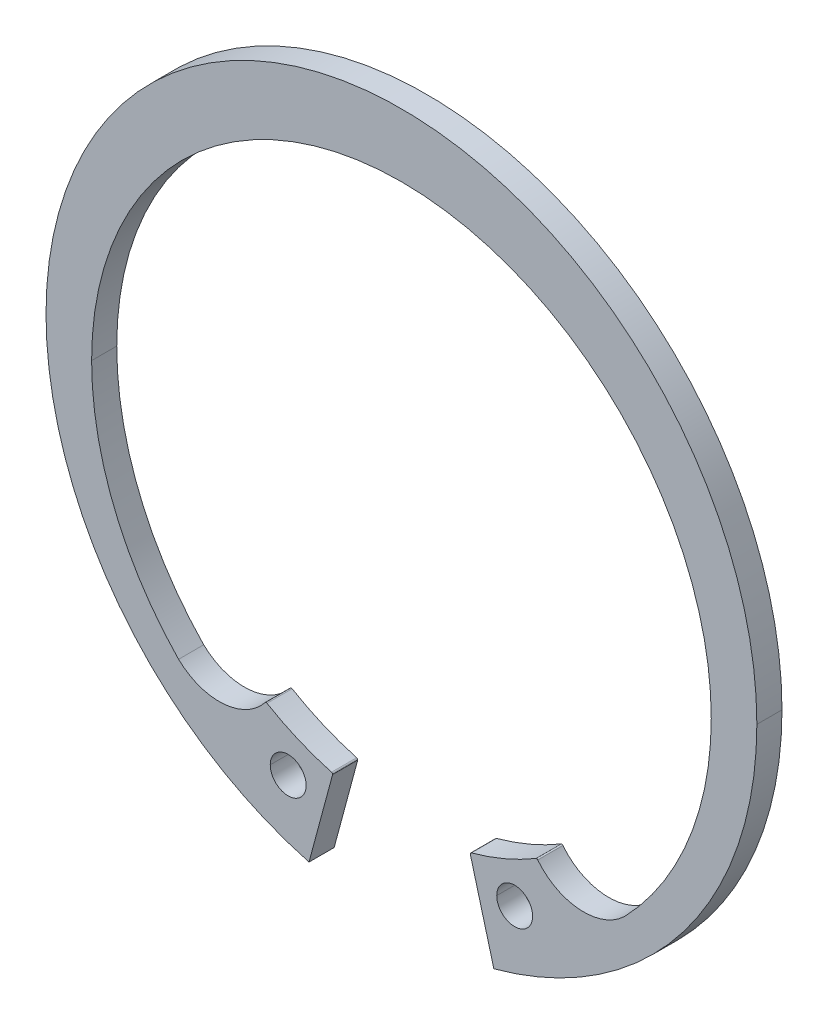
ISO-10303-21;
HEADER;
FILE_DESCRIPTION(('STEP AP214'),'2;1');
FILE_NAME('part.step','',(''),(''),'','','');
FILE_SCHEMA(('AUTOMOTIVE_DESIGN { 1 0 10303 214 1 1 1 1 }'));
ENDSEC;
DATA;
#1=APPLICATION_CONTEXT('core data for automotive mechanical design processes');
#2=APPLICATION_PROTOCOL_DEFINITION('international standard','automotive_design',2000,#1);
#3=PRODUCT_CONTEXT('',#1,'mechanical');
#4=PRODUCT('Part','Part','',(#3));
#5=PRODUCT_RELATED_PRODUCT_CATEGORY('part','',(#4));
#6=PRODUCT_DEFINITION_FORMATION('','',#4);
#7=PRODUCT_DEFINITION_CONTEXT('part definition',#1,'design');
#8=PRODUCT_DEFINITION('design','',#6,#7);
#9=PRODUCT_DEFINITION_SHAPE('','',#8);
#10=(LENGTH_UNIT() NAMED_UNIT(*) SI_UNIT(.MILLI.,.METRE.));
#11=(NAMED_UNIT(*) PLANE_ANGLE_UNIT() SI_UNIT($,.RADIAN.));
#12=(NAMED_UNIT(*) SI_UNIT($,.STERADIAN.) SOLID_ANGLE_UNIT());
#13=UNCERTAINTY_MEASURE_WITH_UNIT(LENGTH_MEASURE(1.E-05),#10,'distance_accuracy_value','');
#14=(GEOMETRIC_REPRESENTATION_CONTEXT(3) GLOBAL_UNCERTAINTY_ASSIGNED_CONTEXT((#13)) GLOBAL_UNIT_ASSIGNED_CONTEXT((#10,
#11,#12)) REPRESENTATION_CONTEXT('',''));
#15=CARTESIAN_POINT('',(0.,0.,0.));
#16=DIRECTION('',(0.,0.,1.));
#17=DIRECTION('',(1.,0.,0.));
#18=AXIS2_PLACEMENT_3D('',#15,#16,#17);
#19=CARTESIAN_POINT('',(-4.89431786511228,-17.788989646274,-1.75));
#20=DIRECTION('',(0.,0.,1.));
#21=DIRECTION('',(1.,0.,0.));
#22=AXIS2_PLACEMENT_3D('',#19,#20,#21);
#23=CYLINDRICAL_SURFACE('',#22,0.0999999999999985);
#24=DIRECTION('',(0.,0.,1.));
#25=VECTOR('',#24,1.);
#26=CARTESIAN_POINT('',(-4.79431786511229,-17.788989646274,-1.75));
#27=LINE('',#26,#25);
#28=CARTESIAN_POINT('',(-4.79431786511229,-17.788989646274,-1.75));
#29=VERTEX_POINT('',#28);
#30=CARTESIAN_POINT('',(-4.79431786511229,-17.788989646274,0.));
#31=VERTEX_POINT('',#30);
#32=EDGE_CURVE('E280',#29,#31,#27,.T.);
#33=ORIENTED_EDGE('',*,*,#32,.F.);
#34=CARTESIAN_POINT('',(-4.89431786511228,-17.788989646274,-1.75));
#35=DIRECTION('',(0.,0.,1.));
#36=DIRECTION('',(-1.,0.,0.));
#37=AXIS2_PLACEMENT_3D('',#34,#35,#36);
#38=CIRCLE('',#37,0.0999999999999985);
#39=CARTESIAN_POINT('',(-4.8677903970087,-17.6925723582183,-1.75));
#40=VERTEX_POINT('',#39);
#41=EDGE_CURVE('E285',#29,#40,#38,.T.);
#42=ORIENTED_EDGE('',*,*,#41,.T.);
#43=DIRECTION('',(0.,0.,1.));
#44=VECTOR('',#43,1.);
#45=CARTESIAN_POINT('',(-4.8677903970087,-17.6925723582183,-1.75));
#46=LINE('',#45,#44);
#47=CARTESIAN_POINT('',(-4.8677903970087,-17.6925723582183,0.));
#48=VERTEX_POINT('',#47);
#49=EDGE_CURVE('E334',#40,#48,#46,.T.);
#50=ORIENTED_EDGE('',*,*,#49,.T.);
#51=CARTESIAN_POINT('',(-4.89431786511228,-17.788989646274,0.));
#52=DIRECTION('',(0.,0.,1.));
#53=DIRECTION('',(-1.,0.,0.));
#54=AXIS2_PLACEMENT_3D('',#51,#52,#53);
#55=CIRCLE('',#54,0.0999999999999985);
#56=EDGE_CURVE('E179',#31,#48,#55,.T.);
#57=ORIENTED_EDGE('',*,*,#56,.F.);
#58=EDGE_LOOP('',(#33,#42,#50,#57));
#59=FACE_BOUND('',#58,.T.);
#60=ADVANCED_FACE('F17',(#59),#23,.T.);
#61=CARTESIAN_POINT('',(-9.41305019519653,-15.868112238786,-1.75));
#62=DIRECTION('',(0.,0.,1.));
#63=DIRECTION('',(1.,0.,0.));
#64=AXIS2_PLACEMENT_3D('',#61,#62,#63);
#65=CYLINDRICAL_SURFACE('',#64,0.0999999999999977);
#66=CARTESIAN_POINT('',(-9.41305019519653,-15.868112238786,0.));
#67=DIRECTION('',(0.,0.,1.));
#68=DIRECTION('',(1.,0.,0.));
#69=AXIS2_PLACEMENT_3D('',#66,#67,#68);
#70=CIRCLE('',#69,0.0999999999999977);
#71=CARTESIAN_POINT('',(-9.36203095294614,-15.7821062103915,0.));
#72=VERTEX_POINT('',#71);
#73=CARTESIAN_POINT('',(-9.49123336413031,-15.8057632845408,0.));
#74=VERTEX_POINT('',#73);
#75=EDGE_CURVE('E374',#72,#74,#70,.T.);
#76=ORIENTED_EDGE('',*,*,#75,.F.);
#77=DIRECTION('',(0.,0.,1.));
#78=VECTOR('',#77,1.);
#79=CARTESIAN_POINT('',(-9.36203095294614,-15.7821062103915,-1.75));
#80=LINE('',#79,#78);
#81=CARTESIAN_POINT('',(-9.36203095294614,-15.7821062103915,-1.75));
#82=VERTEX_POINT('',#81);
#83=EDGE_CURVE('E253',#82,#72,#80,.T.);
#84=ORIENTED_EDGE('',*,*,#83,.F.);
#85=CARTESIAN_POINT('',(-9.41305019519653,-15.868112238786,-1.75));
#86=DIRECTION('',(0.,0.,1.));
#87=DIRECTION('',(1.,0.,0.));
#88=AXIS2_PLACEMENT_3D('',#85,#86,#87);
#89=CIRCLE('',#88,0.0999999999999977);
#90=CARTESIAN_POINT('',(-9.49123336413031,-15.8057632845408,-1.75));
#91=VERTEX_POINT('',#90);
#92=EDGE_CURVE('E260',#82,#91,#89,.T.);
#93=ORIENTED_EDGE('',*,*,#92,.T.);
#94=DIRECTION('',(0.,0.,1.));
#95=VECTOR('',#94,1.);
#96=CARTESIAN_POINT('',(-9.49123336413031,-15.8057632845408,-1.75));
#97=LINE('',#96,#95);
#98=EDGE_CURVE('E11',#91,#74,#97,.T.);
#99=ORIENTED_EDGE('',*,*,#98,.T.);
#100=EDGE_LOOP('',(#76,#84,#93,#99));
#101=FACE_BOUND('',#100,.T.);
#102=ADVANCED_FACE('F19',(#101),#65,.T.);
#103=CARTESIAN_POINT('',(-12.6890046847331,-13.2556274883847,-1.75));
#104=DIRECTION('',(0.,0.,1.));
#105=DIRECTION('',(1.,0.,0.));
#106=AXIS2_PLACEMENT_3D('',#103,#104,#105);
#107=CYLINDRICAL_SURFACE('',#106,4.09010195443912);
#108=CARTESIAN_POINT('',(-12.6890046847331,-13.2556274883847,0.));
#109=DIRECTION('',(0.,0.,-1.));
#110=DIRECTION('',(1.,0.,0.));
#111=AXIS2_PLACEMENT_3D('',#108,#109,#110);
#112=CIRCLE('',#111,4.09010195443912);
#113=CARTESIAN_POINT('',(-15.51730565808,-16.2102251939737,0.));
#114=VERTEX_POINT('',#113);
#115=EDGE_CURVE('E370',#74,#114,#112,.T.);
#116=ORIENTED_EDGE('',*,*,#115,.F.);
#117=ORIENTED_EDGE('',*,*,#98,.F.);
#118=CARTESIAN_POINT('',(-12.6890046847331,-13.2556274883847,-1.75));
#119=DIRECTION('',(0.,0.,-1.));
#120=DIRECTION('',(1.,0.,0.));
#121=AXIS2_PLACEMENT_3D('',#118,#119,#120);
#122=CIRCLE('',#121,4.09010195443912);
#123=CARTESIAN_POINT('',(-15.51730565808,-16.2102251939737,-1.75));
#124=VERTEX_POINT('',#123);
#125=EDGE_CURVE('E256',#91,#124,#122,.T.);
#126=ORIENTED_EDGE('',*,*,#125,.T.);
#127=DIRECTION('',(0.,0.,1.));
#128=VECTOR('',#127,1.);
#129=CARTESIAN_POINT('',(-15.51730565808,-16.2102251939737,-1.75));
#130=LINE('',#129,#128);
#131=EDGE_CURVE('E28',#124,#114,#130,.T.);
#132=ORIENTED_EDGE('',*,*,#131,.T.);
#133=EDGE_LOOP('',(#116,#117,#126,#132));
#134=FACE_BOUND('',#133,.T.);
#135=ADVANCED_FACE('F257',(#134),#107,.F.);
#136=CARTESIAN_POINT('',(-17.1145975992995,-17.8788436151238,-1.75));
#137=DIRECTION('',(-0.722377519802981,0.69149889290099,0.));
#138=DIRECTION('',(0.,0.,1.));
#139=AXIS2_PLACEMENT_3D('',#136,#137,#138);
#140=PLANE('',#139);
#141=DIRECTION('',(-0.691498892900989,-0.722377519802981,0.));
#142=VECTOR('',#141,1.);
#143=CARTESIAN_POINT('',(-17.1145975992995,-17.8788436151238,-1.75));
#144=LINE('',#143,#142);
#145=CARTESIAN_POINT('',(-15.5200012228605,-16.213041128201,-1.75));
#146=VERTEX_POINT('',#145);
#147=EDGE_CURVE('E248',#124,#146,#144,.T.);
#148=ORIENTED_EDGE('',*,*,#147,.T.);
#149=DIRECTION('',(0.,0.,1.));
#150=VECTOR('',#149,1.);
#151=CARTESIAN_POINT('',(-15.5200012228605,-16.213041128201,-1.75));
#152=LINE('',#151,#150);
#153=CARTESIAN_POINT('',(-15.5200012228605,-16.213041128201,0.));
#154=VERTEX_POINT('',#153);
#155=EDGE_CURVE('E302',#146,#154,#152,.T.);
#156=ORIENTED_EDGE('',*,*,#155,.T.);
#157=DIRECTION('',(-0.691498892900989,-0.722377519802981,0.));
#158=VECTOR('',#157,1.);
#159=CARTESIAN_POINT('',(-17.1145975992995,-17.8788436151238,0.));
#160=LINE('',#159,#158);
#161=EDGE_CURVE('E250',#114,#154,#160,.T.);
#162=ORIENTED_EDGE('',*,*,#161,.F.);
#163=ORIENTED_EDGE('',*,*,#131,.F.);
#164=EDGE_LOOP('',(#148,#156,#162,#163));
#165=FACE_BOUND('',#164,.T.);
#166=ADVANCED_FACE('F245',(#165),#140,.T.);
#167=CARTESIAN_POINT('',(0.,0.,-1.75));
#168=DIRECTION('',(0.,0.,1.));
#169=DIRECTION('',(1.,0.,0.));
#170=AXIS2_PLACEMENT_3D('',#167,#168,#169);
#171=CYLINDRICAL_SURFACE('',#170,18.35);
#172=CARTESIAN_POINT('',(0.,0.,0.));
#173=DIRECTION('',(0.,0.,-1.));
#174=DIRECTION('',(1.,0.,0.));
#175=AXIS2_PLACEMENT_3D('',#172,#173,#174);
#176=CIRCLE('',#175,18.35);
#177=EDGE_CURVE('E416',#48,#72,#176,.T.);
#178=ORIENTED_EDGE('',*,*,#177,.F.);
#179=ORIENTED_EDGE('',*,*,#49,.F.);
#180=CARTESIAN_POINT('',(0.,0.,-1.75));
#181=DIRECTION('',(0.,0.,-1.));
#182=DIRECTION('',(1.,0.,0.));
#183=AXIS2_PLACEMENT_3D('',#180,#181,#182);
#184=CIRCLE('',#183,18.35);
#185=EDGE_CURVE('E290',#40,#82,#184,.T.);
#186=ORIENTED_EDGE('',*,*,#185,.T.);
#187=ORIENTED_EDGE('',*,*,#83,.T.);
#188=EDGE_LOOP('',(#178,#179,#186,#187));
#189=FACE_BOUND('',#188,.T.);
#190=ADVANCED_FACE('F698',(#189),#171,.F.);
#191=CARTESIAN_POINT('',(15.51730565808,-16.2102251939737,-1.75));
#192=DIRECTION('',(0.722377519802981,0.69149889290099,0.));
#193=DIRECTION('',(0.,0.,-1.));
#194=AXIS2_PLACEMENT_3D('',#191,#192,#193);
#195=PLANE('',#194);
#196=DIRECTION('',(-0.691498892900989,0.722377519802981,0.));
#197=VECTOR('',#196,1.);
#198=CARTESIAN_POINT('',(15.51730565808,-16.2102251939737,0.));
#199=LINE('',#198,#197);
#200=CARTESIAN_POINT('',(15.5200012228605,-16.213041128201,0.));
#201=VERTEX_POINT('',#200);
#202=CARTESIAN_POINT('',(15.51730565808,-16.2102251939737,0.));
#203=VERTEX_POINT('',#202);
#204=EDGE_CURVE('E308',#201,#203,#199,.T.);
#205=ORIENTED_EDGE('',*,*,#204,.F.);
#206=DIRECTION('',(0.,0.,-1.));
#207=VECTOR('',#206,1.);
#208=CARTESIAN_POINT('',(15.5200012228605,-16.213041128201,-1.75));
#209=LINE('',#208,#207);
#210=CARTESIAN_POINT('',(15.5200012228605,-16.213041128201,-1.75));
#211=VERTEX_POINT('',#210);
#212=EDGE_CURVE('E278',#201,#211,#209,.T.);
#213=ORIENTED_EDGE('',*,*,#212,.T.);
#214=DIRECTION('',(-0.691498892900989,0.722377519802981,0.));
#215=VECTOR('',#214,1.);
#216=CARTESIAN_POINT('',(15.51730565808,-16.2102251939737,-1.75));
#217=LINE('',#216,#215);
#218=CARTESIAN_POINT('',(15.51730565808,-16.2102251939737,-1.75));
#219=VERTEX_POINT('',#218);
#220=EDGE_CURVE('E291',#211,#219,#217,.T.);
#221=ORIENTED_EDGE('',*,*,#220,.T.);
#222=DIRECTION('',(0.,0.,1.));
#223=VECTOR('',#222,1.);
#224=CARTESIAN_POINT('',(15.51730565808,-16.2102251939737,-1.75));
#225=LINE('',#224,#223);
#226=EDGE_CURVE('E337',#219,#203,#225,.T.);
#227=ORIENTED_EDGE('',*,*,#226,.T.);
#228=EDGE_LOOP('',(#205,#213,#221,#227));
#229=FACE_BOUND('',#228,.T.);
#230=ADVANCED_FACE('F795',(#229),#195,.T.);
#231=CARTESIAN_POINT('',(12.6890046847331,-13.2556274883847,-1.75));
#232=DIRECTION('',(0.,0.,1.));
#233=DIRECTION('',(1.,0.,0.));
#234=AXIS2_PLACEMENT_3D('',#231,#232,#233);
#235=CYLINDRICAL_SURFACE('',#234,4.09010195443912);
#236=CARTESIAN_POINT('',(12.6890046847331,-13.2556274883847,0.));
#237=DIRECTION('',(0.,0.,-1.));
#238=DIRECTION('',(1.,0.,0.));
#239=AXIS2_PLACEMENT_3D('',#236,#237,#238);
#240=CIRCLE('',#239,4.09010195443912);
#241=CARTESIAN_POINT('',(9.49123336413031,-15.8057632845408,0.));
#242=VERTEX_POINT('',#241);
#243=EDGE_CURVE('E303',#203,#242,#240,.T.);
#244=ORIENTED_EDGE('',*,*,#243,.F.);
#245=ORIENTED_EDGE('',*,*,#226,.F.);
#246=CARTESIAN_POINT('',(12.6890046847331,-13.2556274883847,-1.75));
#247=DIRECTION('',(0.,0.,-1.));
#248=DIRECTION('',(1.,0.,0.));
#249=AXIS2_PLACEMENT_3D('',#246,#247,#248);
#250=CIRCLE('',#249,4.09010195443912);
#251=CARTESIAN_POINT('',(9.49123336413031,-15.8057632845408,-1.75));
#252=VERTEX_POINT('',#251);
#253=EDGE_CURVE('E296',#219,#252,#250,.T.);
#254=ORIENTED_EDGE('',*,*,#253,.T.);
#255=DIRECTION('',(0.,0.,1.));
#256=VECTOR('',#255,1.);
#257=CARTESIAN_POINT('',(9.49123336413031,-15.8057632845408,-1.75));
#258=LINE('',#257,#256);
#259=EDGE_CURVE('E21',#252,#242,#258,.T.);
#260=ORIENTED_EDGE('',*,*,#259,.T.);
#261=EDGE_LOOP('',(#244,#245,#254,#260));
#262=FACE_BOUND('',#261,.T.);
#263=ADVANCED_FACE('F793',(#262),#235,.F.);
#264=CARTESIAN_POINT('',(9.41305019519653,-15.868112238786,-1.75));
#265=DIRECTION('',(0.,0.,1.));
#266=DIRECTION('',(1.,0.,0.));
#267=AXIS2_PLACEMENT_3D('',#264,#265,#266);
#268=CYLINDRICAL_SURFACE('',#267,0.0999999999999977);
#269=CARTESIAN_POINT('',(9.41305019519653,-15.868112238786,0.));
#270=DIRECTION('',(0.,0.,1.));
#271=DIRECTION('',(-1.,0.,0.));
#272=AXIS2_PLACEMENT_3D('',#269,#270,#271);
#273=CIRCLE('',#272,0.0999999999999977);
#274=CARTESIAN_POINT('',(9.36203095294614,-15.7821062103915,0.));
#275=VERTEX_POINT('',#274);
#276=EDGE_CURVE('E307',#242,#275,#273,.T.);
#277=ORIENTED_EDGE('',*,*,#276,.F.);
#278=ORIENTED_EDGE('',*,*,#259,.F.);
#279=CARTESIAN_POINT('',(9.41305019519653,-15.868112238786,-1.75));
#280=DIRECTION('',(0.,0.,1.));
#281=DIRECTION('',(-1.,0.,0.));
#282=AXIS2_PLACEMENT_3D('',#279,#280,#281);
#283=CIRCLE('',#282,0.0999999999999977);
#284=CARTESIAN_POINT('',(9.36203095294614,-15.7821062103915,-1.75));
#285=VERTEX_POINT('',#284);
#286=EDGE_CURVE('E344',#252,#285,#283,.T.);
#287=ORIENTED_EDGE('',*,*,#286,.T.);
#288=DIRECTION('',(0.,0.,1.));
#289=VECTOR('',#288,1.);
#290=CARTESIAN_POINT('',(9.36203095294614,-15.7821062103915,-1.75));
#291=LINE('',#290,#289);
#292=EDGE_CURVE('E436',#285,#275,#291,.T.);
#293=ORIENTED_EDGE('',*,*,#292,.T.);
#294=EDGE_LOOP('',(#277,#278,#287,#293));
#295=FACE_BOUND('',#294,.T.);
#296=ADVANCED_FACE('F730',(#295),#268,.T.);
#297=CARTESIAN_POINT('',(4.89431786511229,-17.788989646274,-1.75));
#298=DIRECTION('',(0.,0.,1.));
#299=DIRECTION('',(1.,0.,0.));
#300=AXIS2_PLACEMENT_3D('',#297,#298,#299);
#301=CYLINDRICAL_SURFACE('',#300,0.1);
#302=CARTESIAN_POINT('',(4.89431786511229,-17.788989646274,0.));
#303=DIRECTION('',(0.,0.,1.));
#304=DIRECTION('',(1.,0.,0.));
#305=AXIS2_PLACEMENT_3D('',#302,#303,#304);
#306=CIRCLE('',#305,0.1);
#307=CARTESIAN_POINT('',(4.8677903970087,-17.6925723582183,0.));
#308=VERTEX_POINT('',#307);
#309=CARTESIAN_POINT('',(4.79775821297681,-17.814994137799,0.));
#310=VERTEX_POINT('',#309);
#311=EDGE_CURVE('E426',#308,#310,#306,.T.);
#312=ORIENTED_EDGE('',*,*,#311,.F.);
#313=DIRECTION('',(0.,0.,1.));
#314=VECTOR('',#313,1.);
#315=CARTESIAN_POINT('',(4.8677903970087,-17.6925723582183,-1.75));
#316=LINE('',#315,#314);
#317=CARTESIAN_POINT('',(4.8677903970087,-17.6925723582183,-1.75));
#318=VERTEX_POINT('',#317);
#319=EDGE_CURVE('E433',#318,#308,#316,.T.);
#320=ORIENTED_EDGE('',*,*,#319,.F.);
#321=CARTESIAN_POINT('',(4.89431786511229,-17.788989646274,-1.75));
#322=DIRECTION('',(0.,0.,1.));
#323=DIRECTION('',(1.,0.,0.));
#324=AXIS2_PLACEMENT_3D('',#321,#322,#323);
#325=CIRCLE('',#324,0.1);
#326=CARTESIAN_POINT('',(4.79775821297681,-17.814994137799,-1.75));
#327=VERTEX_POINT('',#326);
#328=EDGE_CURVE('E289',#318,#327,#325,.T.);
#329=ORIENTED_EDGE('',*,*,#328,.T.);
#330=DIRECTION('',(0.,0.,1.));
#331=VECTOR('',#330,1.);
#332=CARTESIAN_POINT('',(4.79775821297681,-17.814994137799,-1.75));
#333=LINE('',#332,#331);
#334=EDGE_CURVE('E322',#327,#310,#333,.T.);
#335=ORIENTED_EDGE('',*,*,#334,.T.);
#336=EDGE_LOOP('',(#312,#320,#329,#335));
#337=FACE_BOUND('',#336,.T.);
#338=ADVANCED_FACE('F471',(#337),#301,.T.);
#339=CARTESIAN_POINT('',(0.,0.,-1.75));
#340=DIRECTION('',(0.,0.,1.));
#341=DIRECTION('',(1.,0.,0.));
#342=AXIS2_PLACEMENT_3D('',#339,#340,#341);
#343=CYLINDRICAL_SURFACE('',#342,18.35);
#344=CARTESIAN_POINT('',(0.,0.,0.));
#345=DIRECTION('',(0.,0.,-1.));
#346=DIRECTION('',(1.,0.,0.));
#347=AXIS2_PLACEMENT_3D('',#344,#345,#346);
#348=CIRCLE('',#347,18.35);
#349=EDGE_CURVE('E364',#275,#308,#348,.T.);
#350=ORIENTED_EDGE('',*,*,#349,.F.);
#351=ORIENTED_EDGE('',*,*,#292,.F.);
#352=CARTESIAN_POINT('',(0.,0.,-1.75));
#353=DIRECTION('',(0.,0.,-1.));
#354=DIRECTION('',(1.,0.,0.));
#355=AXIS2_PLACEMENT_3D('',#352,#353,#354);
#356=CIRCLE('',#355,18.35);
#357=EDGE_CURVE('E386',#285,#318,#356,.T.);
#358=ORIENTED_EDGE('',*,*,#357,.T.);
#359=ORIENTED_EDGE('',*,*,#319,.T.);
#360=EDGE_LOOP('',(#350,#351,#358,#359));
#361=FACE_BOUND('',#360,.T.);
#362=ADVANCED_FACE('F733',(#361),#343,.F.);
#363=CARTESIAN_POINT('',(-7.88649275770018,-19.3819208795914,-1.75));
#364=DIRECTION('',(0.,0.,1.));
#365=DIRECTION('',(1.,0.,0.));
#366=AXIS2_PLACEMENT_3D('',#363,#364,#365);
#367=CYLINDRICAL_SURFACE('',#366,1.25);
#368=DIRECTION('',(0.,0.,1.));
#369=VECTOR('',#368,1.);
#370=CARTESIAN_POINT('',(-9.13649275770018,-19.3819208795914,-1.75));
#371=LINE('',#370,#369);
#372=CARTESIAN_POINT('',(-9.13649275770018,-19.3819208795914,-1.75));
#373=VERTEX_POINT('',#372);
#374=CARTESIAN_POINT('',(-9.13649275770018,-19.3819208795914,0.));
#375=VERTEX_POINT('',#374);
#376=EDGE_CURVE('E410',#373,#375,#371,.T.);
#377=ORIENTED_EDGE('',*,*,#376,.F.);
#378=CARTESIAN_POINT('',(-7.88649275770018,-19.3819208795914,-1.75));
#379=DIRECTION('',(0.,0.,1.));
#380=DIRECTION('',(1.,0.,0.));
#381=AXIS2_PLACEMENT_3D('',#378,#379,#380);
#382=CIRCLE('',#381,1.25);
#383=CARTESIAN_POINT('',(-6.63649275770018,-19.3819208795914,-1.75));
#384=VERTEX_POINT('',#383);
#385=EDGE_CURVE('E375',#384,#373,#382,.T.);
#386=ORIENTED_EDGE('',*,*,#385,.F.);
#387=DIRECTION('',(0.,0.,1.));
#388=VECTOR('',#387,1.);
#389=CARTESIAN_POINT('',(-6.63649275770018,-19.3819208795914,-1.75));
#390=LINE('',#389,#388);
#391=CARTESIAN_POINT('',(-6.63649275770018,-19.3819208795914,0.));
#392=VERTEX_POINT('',#391);
#393=EDGE_CURVE('E318',#384,#392,#390,.T.);
#394=ORIENTED_EDGE('',*,*,#393,.T.);
#395=CARTESIAN_POINT('',(-7.88649275770018,-19.3819208795914,0.));
#396=DIRECTION('',(0.,0.,1.));
#397=DIRECTION('',(1.,0.,0.));
#398=AXIS2_PLACEMENT_3D('',#395,#396,#397);
#399=CIRCLE('',#398,1.25);
#400=EDGE_CURVE('E718',#392,#375,#399,.T.);
#401=ORIENTED_EDGE('',*,*,#400,.T.);
#402=EDGE_LOOP('',(#377,#386,#394,#401));
#403=FACE_BOUND('',#402,.T.);
#404=ADVANCED_FACE('F488',(#403),#367,.F.);
#405=CARTESIAN_POINT('',(7.88649275770018,-19.3819208795914,-1.75));
#406=DIRECTION('',(0.,0.,1.));
#407=DIRECTION('',(1.,0.,0.));
#408=AXIS2_PLACEMENT_3D('',#405,#406,#407);
#409=CYLINDRICAL_SURFACE('',#408,1.25);
#410=DIRECTION('',(0.,0.,1.));
#411=VECTOR('',#410,1.);
#412=CARTESIAN_POINT('',(6.63649275770018,-19.3819208795914,-1.75));
#413=LINE('',#412,#411);
#414=CARTESIAN_POINT('',(6.63649275770018,-19.3819208795914,-1.75));
#415=VERTEX_POINT('',#414);
#416=CARTESIAN_POINT('',(6.63649275770018,-19.3819208795914,0.));
#417=VERTEX_POINT('',#416);
#418=EDGE_CURVE('E317',#415,#417,#413,.T.);
#419=ORIENTED_EDGE('',*,*,#418,.F.);
#420=CARTESIAN_POINT('',(7.88649275770018,-19.3819208795914,-1.75));
#421=DIRECTION('',(0.,0.,1.));
#422=DIRECTION('',(1.,0.,0.));
#423=AXIS2_PLACEMENT_3D('',#420,#421,#422);
#424=CIRCLE('',#423,1.25);
#425=CARTESIAN_POINT('',(9.13649275770018,-19.3819208795914,-1.75));
#426=VERTEX_POINT('',#425);
#427=EDGE_CURVE('E295',#426,#415,#424,.T.);
#428=ORIENTED_EDGE('',*,*,#427,.F.);
#429=DIRECTION('',(0.,0.,1.));
#430=VECTOR('',#429,1.);
#431=CARTESIAN_POINT('',(9.13649275770018,-19.3819208795914,-1.75));
#432=LINE('',#431,#430);
#433=CARTESIAN_POINT('',(9.13649275770018,-19.3819208795914,0.));
#434=VERTEX_POINT('',#433);
#435=EDGE_CURVE('E356',#426,#434,#432,.T.);
#436=ORIENTED_EDGE('',*,*,#435,.T.);
#437=CARTESIAN_POINT('',(7.88649275770018,-19.3819208795914,0.));
#438=DIRECTION('',(0.,0.,1.));
#439=DIRECTION('',(1.,0.,0.));
#440=AXIS2_PLACEMENT_3D('',#437,#438,#439);
#441=CIRCLE('',#440,1.25);
#442=EDGE_CURVE('E373',#434,#417,#441,.T.);
#443=ORIENTED_EDGE('',*,*,#442,.T.);
#444=EDGE_LOOP('',(#419,#428,#436,#443));
#445=FACE_BOUND('',#444,.T.);
#446=ADVANCED_FACE('F507',(#445),#409,.F.);
#447=CARTESIAN_POINT('',(0.,0.,0.));
#448=DIRECTION('',(0.,0.,1.));
#449=DIRECTION('',(1.,0.,0.));
#450=AXIS2_PLACEMENT_3D('',#447,#448,#449);
#451=PLANE('',#450);
#452=ORIENTED_EDGE('',*,*,#400,.F.);
#453=CARTESIAN_POINT('',(-7.88649275770018,-19.3819208795914,0.));
#454=DIRECTION('',(0.,0.,1.));
#455=DIRECTION('',(1.,0.,0.));
#456=AXIS2_PLACEMENT_3D('',#453,#454,#455);
#457=CIRCLE('',#456,1.25);
#458=EDGE_CURVE('E432',#375,#392,#457,.T.);
#459=ORIENTED_EDGE('',*,*,#458,.F.);
#460=EDGE_LOOP('',(#452,#459));
#461=FACE_BOUND('',#460,.T.);
#462=ORIENTED_EDGE('',*,*,#442,.F.);
#463=CARTESIAN_POINT('',(7.88649275770018,-19.3819208795914,0.));
#464=DIRECTION('',(0.,0.,1.));
#465=DIRECTION('',(1.,0.,0.));
#466=AXIS2_PLACEMENT_3D('',#463,#464,#465);
#467=CIRCLE('',#466,1.25);
#468=EDGE_CURVE('E352',#417,#434,#467,.T.);
#469=ORIENTED_EDGE('',*,*,#468,.F.);
#470=EDGE_LOOP('',(#462,#469));
#471=FACE_BOUND('',#470,.T.);
#472=ORIENTED_EDGE('',*,*,#161,.T.);
#473=CARTESIAN_POINT('',(0.,-1.22542652111631,0.));
#474=DIRECTION('',(0.,0.,-1.));
#475=DIRECTION('',(1.,0.,0.));
#476=AXIS2_PLACEMENT_3D('',#473,#474,#475);
#477=CIRCLE('',#476,21.5754265211164);
#478=CARTESIAN_POINT('',(-21.5754265211164,-1.22542652111631,0.));
#479=VERTEX_POINT('',#478);
#480=EDGE_CURVE('E365',#154,#479,#477,.T.);
#481=ORIENTED_EDGE('',*,*,#480,.T.);
#482=CARTESIAN_POINT('',(0.,-1.22542652111631,0.));
#483=DIRECTION('',(0.,0.,-1.));
#484=DIRECTION('',(1.,0.,0.));
#485=AXIS2_PLACEMENT_3D('',#482,#483,#484);
#486=CIRCLE('',#485,21.5754265211164);
#487=CARTESIAN_POINT('',(21.5754265211164,-1.22542652111631,0.));
#488=VERTEX_POINT('',#487);
#489=EDGE_CURVE('E392',#479,#488,#486,.T.);
#490=ORIENTED_EDGE('',*,*,#489,.T.);
#491=CARTESIAN_POINT('',(0.,-1.22542652111631,0.));
#492=DIRECTION('',(0.,0.,-1.));
#493=DIRECTION('',(1.,0.,0.));
#494=AXIS2_PLACEMENT_3D('',#491,#492,#493);
#495=CIRCLE('',#494,21.5754265211164);
#496=EDGE_CURVE('E330',#488,#201,#495,.T.);
#497=ORIENTED_EDGE('',*,*,#496,.T.);
#498=ORIENTED_EDGE('',*,*,#204,.T.);
#499=ORIENTED_EDGE('',*,*,#243,.T.);
#500=ORIENTED_EDGE('',*,*,#276,.T.);
#501=ORIENTED_EDGE('',*,*,#349,.T.);
#502=ORIENTED_EDGE('',*,*,#311,.T.);
#503=DIRECTION('',(0.260044915250468,-0.965596521354741,0.));
#504=VECTOR('',#503,1.);
#505=CARTESIAN_POINT('',(6.4361116524491,-23.8985139035299,0.));
#506=LINE('',#505,#504);
#507=CARTESIAN_POINT('',(6.4361116524491,-23.8985139035299,0.));
#508=VERTEX_POINT('',#507);
#509=EDGE_CURVE('E319',#310,#508,#506,.T.);
#510=ORIENTED_EDGE('',*,*,#509,.T.);
#511=CARTESIAN_POINT('',(0.,0.,0.));
#512=DIRECTION('',(0.,0.,1.));
#513=DIRECTION('',(1.,0.,0.));
#514=AXIS2_PLACEMENT_3D('',#511,#512,#513);
#515=CIRCLE('',#514,24.75);
#516=CARTESIAN_POINT('',(24.75,0.,0.));
#517=VERTEX_POINT('',#516);
#518=EDGE_CURVE('E340',#508,#517,#515,.T.);
#519=ORIENTED_EDGE('',*,*,#518,.T.);
#520=CARTESIAN_POINT('',(0.,0.,0.));
#521=DIRECTION('',(0.,0.,1.));
#522=DIRECTION('',(1.,0.,0.));
#523=AXIS2_PLACEMENT_3D('',#520,#521,#522);
#524=CIRCLE('',#523,24.75);
#525=CARTESIAN_POINT('',(-24.75,0.,0.));
#526=VERTEX_POINT('',#525);
#527=EDGE_CURVE('E419',#517,#526,#524,.T.);
#528=ORIENTED_EDGE('',*,*,#527,.T.);
#529=CARTESIAN_POINT('',(0.,0.,0.));
#530=DIRECTION('',(0.,0.,1.));
#531=DIRECTION('',(1.,0.,0.));
#532=AXIS2_PLACEMENT_3D('',#529,#530,#531);
#533=CIRCLE('',#532,24.75);
#534=CARTESIAN_POINT('',(-6.4361116524491,-23.8985139035299,0.));
#535=VERTEX_POINT('',#534);
#536=EDGE_CURVE('E223',#526,#535,#533,.T.);
#537=ORIENTED_EDGE('',*,*,#536,.T.);
#538=DIRECTION('',(0.260044915250469,0.965596521354741,0.));
#539=VECTOR('',#538,1.);
#540=CARTESIAN_POINT('',(-6.4361116524491,-23.8985139035299,0.));
#541=LINE('',#540,#539);
#542=CARTESIAN_POINT('',(-4.79775821297681,-17.8149941377991,0.));
#543=VERTEX_POINT('',#542);
#544=EDGE_CURVE('E164',#535,#543,#541,.T.);
#545=ORIENTED_EDGE('',*,*,#544,.T.);
#546=CARTESIAN_POINT('',(-4.89431786511228,-17.788989646274,0.));
#547=DIRECTION('',(0.,0.,1.));
#548=DIRECTION('',(-1.,0.,0.));
#549=AXIS2_PLACEMENT_3D('',#546,#547,#548);
#550=CIRCLE('',#549,0.0999999999999985);
#551=EDGE_CURVE('E283',#543,#31,#550,.T.);
#552=ORIENTED_EDGE('',*,*,#551,.T.);
#553=ORIENTED_EDGE('',*,*,#56,.T.);
#554=ORIENTED_EDGE('',*,*,#177,.T.);
#555=ORIENTED_EDGE('',*,*,#75,.T.);
#556=ORIENTED_EDGE('',*,*,#115,.T.);
#557=EDGE_LOOP('',(#472,#481,#490,#497,#498,#499,#500,#501,#502,#510,#519,#528,#537,#545,#552,
#553,#554,#555,#556));
#558=FACE_BOUND('',#557,.T.);
#559=ADVANCED_FACE('F466',(#461,#471,#558),#451,.T.);
#560=CARTESIAN_POINT('',(0.,0.,-1.75));
#561=DIRECTION('',(0.,0.,1.));
#562=DIRECTION('',(1.,0.,0.));
#563=AXIS2_PLACEMENT_3D('',#560,#561,#562);
#564=PLANE('',#563);
#565=ORIENTED_EDGE('',*,*,#385,.T.);
#566=CARTESIAN_POINT('',(-7.88649275770018,-19.3819208795914,-1.75));
#567=DIRECTION('',(0.,0.,1.));
#568=DIRECTION('',(1.,0.,0.));
#569=AXIS2_PLACEMENT_3D('',#566,#567,#568);
#570=CIRCLE('',#569,1.25);
#571=EDGE_CURVE('E351',#373,#384,#570,.T.);
#572=ORIENTED_EDGE('',*,*,#571,.T.);
#573=EDGE_LOOP('',(#565,#572));
#574=FACE_BOUND('',#573,.T.);
#575=ORIENTED_EDGE('',*,*,#427,.T.);
#576=CARTESIAN_POINT('',(7.88649275770018,-19.3819208795914,-1.75));
#577=DIRECTION('',(0.,0.,1.));
#578=DIRECTION('',(1.,0.,0.));
#579=AXIS2_PLACEMENT_3D('',#576,#577,#578);
#580=CIRCLE('',#579,1.25);
#581=EDGE_CURVE('E313',#415,#426,#580,.T.);
#582=ORIENTED_EDGE('',*,*,#581,.T.);
#583=EDGE_LOOP('',(#575,#582));
#584=FACE_BOUND('',#583,.T.);
#585=CARTESIAN_POINT('',(0.,-1.22542652111631,-1.75));
#586=DIRECTION('',(0.,0.,-1.));
#587=DIRECTION('',(1.,0.,0.));
#588=AXIS2_PLACEMENT_3D('',#585,#586,#587);
#589=CIRCLE('',#588,21.5754265211164);
#590=CARTESIAN_POINT('',(-21.5754265211164,-1.22542652111631,-1.75));
#591=VERTEX_POINT('',#590);
#592=EDGE_CURVE('E266',#146,#591,#589,.T.);
#593=ORIENTED_EDGE('',*,*,#592,.F.);
#594=ORIENTED_EDGE('',*,*,#147,.F.);
#595=ORIENTED_EDGE('',*,*,#125,.F.);
#596=ORIENTED_EDGE('',*,*,#92,.F.);
#597=ORIENTED_EDGE('',*,*,#185,.F.);
#598=ORIENTED_EDGE('',*,*,#41,.F.);
#599=CARTESIAN_POINT('',(-4.89431786511228,-17.788989646274,-1.75));
#600=DIRECTION('',(0.,0.,1.));
#601=DIRECTION('',(-1.,0.,0.));
#602=AXIS2_PLACEMENT_3D('',#599,#600,#601);
#603=CIRCLE('',#602,0.0999999999999985);
#604=CARTESIAN_POINT('',(-4.79775821297681,-17.8149941377991,-1.75));
#605=VERTEX_POINT('',#604);
#606=EDGE_CURVE('E284',#605,#29,#603,.T.);
#607=ORIENTED_EDGE('',*,*,#606,.F.);
#608=DIRECTION('',(0.260044915250469,0.965596521354741,0.));
#609=VECTOR('',#608,1.);
#610=CARTESIAN_POINT('',(-6.4361116524491,-23.8985139035299,-1.75));
#611=LINE('',#610,#609);
#612=CARTESIAN_POINT('',(-6.4361116524491,-23.8985139035299,-1.75));
#613=VERTEX_POINT('',#612);
#614=EDGE_CURVE('E268',#613,#605,#611,.T.);
#615=ORIENTED_EDGE('',*,*,#614,.F.);
#616=CARTESIAN_POINT('',(0.,0.,-1.75));
#617=DIRECTION('',(0.,0.,1.));
#618=DIRECTION('',(1.,0.,0.));
#619=AXIS2_PLACEMENT_3D('',#616,#617,#618);
#620=CIRCLE('',#619,24.75);
#621=CARTESIAN_POINT('',(-24.75,0.,-1.75));
#622=VERTEX_POINT('',#621);
#623=EDGE_CURVE('E212',#622,#613,#620,.T.);
#624=ORIENTED_EDGE('',*,*,#623,.F.);
#625=CARTESIAN_POINT('',(0.,0.,-1.75));
#626=DIRECTION('',(0.,0.,1.));
#627=DIRECTION('',(1.,0.,0.));
#628=AXIS2_PLACEMENT_3D('',#625,#626,#627);
#629=CIRCLE('',#628,24.75);
#630=CARTESIAN_POINT('',(24.75,0.,-1.75));
#631=VERTEX_POINT('',#630);
#632=EDGE_CURVE('E399',#631,#622,#629,.T.);
#633=ORIENTED_EDGE('',*,*,#632,.F.);
#634=CARTESIAN_POINT('',(0.,0.,-1.75));
#635=DIRECTION('',(0.,0.,1.));
#636=DIRECTION('',(1.,0.,0.));
#637=AXIS2_PLACEMENT_3D('',#634,#635,#636);
#638=CIRCLE('',#637,24.75);
#639=CARTESIAN_POINT('',(6.4361116524491,-23.8985139035299,-1.75));
#640=VERTEX_POINT('',#639);
#641=EDGE_CURVE('E203',#640,#631,#638,.T.);
#642=ORIENTED_EDGE('',*,*,#641,.F.);
#643=DIRECTION('',(0.260044915250468,-0.965596521354741,0.));
#644=VECTOR('',#643,1.);
#645=CARTESIAN_POINT('',(6.4361116524491,-23.8985139035299,-1.75));
#646=LINE('',#645,#644);
#647=EDGE_CURVE('E359',#327,#640,#646,.T.);
#648=ORIENTED_EDGE('',*,*,#647,.F.);
#649=ORIENTED_EDGE('',*,*,#328,.F.);
#650=ORIENTED_EDGE('',*,*,#357,.F.);
#651=ORIENTED_EDGE('',*,*,#286,.F.);
#652=ORIENTED_EDGE('',*,*,#253,.F.);
#653=ORIENTED_EDGE('',*,*,#220,.F.);
#654=CARTESIAN_POINT('',(0.,-1.22542652111631,-1.75));
#655=DIRECTION('',(0.,0.,-1.));
#656=DIRECTION('',(1.,0.,0.));
#657=AXIS2_PLACEMENT_3D('',#654,#655,#656);
#658=CIRCLE('',#657,21.5754265211164);
#659=CARTESIAN_POINT('',(21.5754265211164,-1.22542652111631,-1.75));
#660=VERTEX_POINT('',#659);
#661=EDGE_CURVE('E380',#660,#211,#658,.T.);
#662=ORIENTED_EDGE('',*,*,#661,.F.);
#663=CARTESIAN_POINT('',(0.,-1.22542652111631,-1.75));
#664=DIRECTION('',(0.,0.,-1.));
#665=DIRECTION('',(1.,0.,0.));
#666=AXIS2_PLACEMENT_3D('',#663,#664,#665);
#667=CIRCLE('',#666,21.5754265211164);
#668=EDGE_CURVE('E297',#591,#660,#667,.T.);
#669=ORIENTED_EDGE('',*,*,#668,.F.);
#670=EDGE_LOOP('',(#593,#594,#595,#596,#597,#598,#607,#615,#624,#633,#642,#648,#649,#650,#651,
#652,#653,#662,#669));
#671=FACE_BOUND('',#670,.T.);
#672=ADVANCED_FACE('F263',(#574,#584,#671),#564,.F.);
#673=CARTESIAN_POINT('',(-6.4361116524491,-23.8985139035299,-1.75));
#674=DIRECTION('',(0.965596521354741,-0.260044915250469,0.));
#675=DIRECTION('',(0.,0.,-1.));
#676=AXIS2_PLACEMENT_3D('',#673,#674,#675);
#677=PLANE('',#676);
#678=ORIENTED_EDGE('',*,*,#544,.F.);
#679=DIRECTION('',(0.,0.,1.));
#680=VECTOR('',#679,1.);
#681=CARTESIAN_POINT('',(-6.4361116524491,-23.8985139035299,-1.75));
#682=LINE('',#681,#680);
#683=EDGE_CURVE('E311',#613,#535,#682,.T.);
#684=ORIENTED_EDGE('',*,*,#683,.F.);
#685=ORIENTED_EDGE('',*,*,#614,.T.);
#686=DIRECTION('',(0.,0.,1.));
#687=VECTOR('',#686,1.);
#688=CARTESIAN_POINT('',(-4.79775821297681,-17.8149941377991,-1.75));
#689=LINE('',#688,#687);
#690=EDGE_CURVE('E325',#605,#543,#689,.T.);
#691=ORIENTED_EDGE('',*,*,#690,.T.);
#692=EDGE_LOOP('',(#678,#684,#685,#691));
#693=FACE_BOUND('',#692,.T.);
#694=ADVANCED_FACE('F498',(#693),#677,.T.);
#695=CARTESIAN_POINT('',(0.,-1.22542652111631,-1.75));
#696=DIRECTION('',(0.,0.,1.));
#697=DIRECTION('',(1.,0.,0.));
#698=AXIS2_PLACEMENT_3D('',#695,#696,#697);
#699=CYLINDRICAL_SURFACE('',#698,21.5754265211164);
#700=DIRECTION('',(0.,0.,1.));
#701=VECTOR('',#700,1.);
#702=CARTESIAN_POINT('',(21.5754265211164,-1.22542652111631,-1.75));
#703=LINE('',#702,#701);
#704=EDGE_CURVE('E301',#660,#488,#703,.T.);
#705=ORIENTED_EDGE('',*,*,#704,.F.);
#706=ORIENTED_EDGE('',*,*,#661,.T.);
#707=ORIENTED_EDGE('',*,*,#212,.F.);
#708=ORIENTED_EDGE('',*,*,#496,.F.);
#709=EDGE_LOOP('',(#705,#706,#707,#708));
#710=FACE_BOUND('',#709,.T.);
#711=ADVANCED_FACE('F792',(#710),#699,.F.);
#712=CARTESIAN_POINT('',(6.4361116524491,-23.8985139035299,-1.75));
#713=DIRECTION('',(-0.965596521354741,-0.260044915250468,0.));
#714=DIRECTION('',(-0.260044915250468,0.965596521354741,0.));
#715=AXIS2_PLACEMENT_3D('',#712,#713,#714);
#716=PLANE('',#715);
#717=ORIENTED_EDGE('',*,*,#509,.F.);
#718=ORIENTED_EDGE('',*,*,#334,.F.);
#719=ORIENTED_EDGE('',*,*,#647,.T.);
#720=DIRECTION('',(0.,0.,1.));
#721=VECTOR('',#720,1.);
#722=CARTESIAN_POINT('',(6.4361116524491,-23.8985139035299,-1.75));
#723=LINE('',#722,#721);
#724=EDGE_CURVE('E312',#640,#508,#723,.T.);
#725=ORIENTED_EDGE('',*,*,#724,.T.);
#726=EDGE_LOOP('',(#717,#718,#719,#725));
#727=FACE_BOUND('',#726,.T.);
#728=ADVANCED_FACE('F461',(#727),#716,.T.);
#729=CARTESIAN_POINT('',(0.,0.,-1.75));
#730=DIRECTION('',(0.,0.,1.));
#731=DIRECTION('',(1.,0.,0.));
#732=AXIS2_PLACEMENT_3D('',#729,#730,#731);
#733=CYLINDRICAL_SURFACE('',#732,24.75);
#734=DIRECTION('',(0.,0.,1.));
#735=VECTOR('',#734,1.);
#736=CARTESIAN_POINT('',(-24.75,0.,-1.75));
#737=LINE('',#736,#735);
#738=EDGE_CURVE('E422',#622,#526,#737,.T.);
#739=ORIENTED_EDGE('',*,*,#738,.F.);
#740=ORIENTED_EDGE('',*,*,#623,.T.);
#741=ORIENTED_EDGE('',*,*,#683,.T.);
#742=ORIENTED_EDGE('',*,*,#536,.F.);
#743=EDGE_LOOP('',(#739,#740,#741,#742));
#744=FACE_BOUND('',#743,.T.);
#745=ADVANCED_FACE('F769',(#744),#733,.T.);
#746=CARTESIAN_POINT('',(0.,0.,-1.75));
#747=DIRECTION('',(0.,0.,1.));
#748=DIRECTION('',(1.,0.,0.));
#749=AXIS2_PLACEMENT_3D('',#746,#747,#748);
#750=CYLINDRICAL_SURFACE('',#749,24.75);
#751=ORIENTED_EDGE('',*,*,#641,.T.);
#752=DIRECTION('',(0.,0.,1.));
#753=VECTOR('',#752,1.);
#754=CARTESIAN_POINT('',(24.75,0.,-1.75));
#755=LINE('',#754,#753);
#756=EDGE_CURVE('E341',#631,#517,#755,.T.);
#757=ORIENTED_EDGE('',*,*,#756,.T.);
#758=ORIENTED_EDGE('',*,*,#518,.F.);
#759=ORIENTED_EDGE('',*,*,#724,.F.);
#760=EDGE_LOOP('',(#751,#757,#758,#759));
#761=FACE_BOUND('',#760,.T.);
#762=ADVANCED_FACE('F464',(#761),#750,.T.);
#763=CARTESIAN_POINT('',(0.,0.,-1.75));
#764=DIRECTION('',(0.,0.,1.));
#765=DIRECTION('',(1.,0.,0.));
#766=AXIS2_PLACEMENT_3D('',#763,#764,#765);
#767=CYLINDRICAL_SURFACE('',#766,24.75);
#768=ORIENTED_EDGE('',*,*,#632,.T.);
#769=ORIENTED_EDGE('',*,*,#738,.T.);
#770=ORIENTED_EDGE('',*,*,#527,.F.);
#771=ORIENTED_EDGE('',*,*,#756,.F.);
#772=EDGE_LOOP('',(#768,#769,#770,#771));
#773=FACE_BOUND('',#772,.T.);
#774=ADVANCED_FACE('F768',(#773),#767,.T.);
#775=CARTESIAN_POINT('',(0.,-1.22542652111631,-1.75));
#776=DIRECTION('',(0.,0.,1.));
#777=DIRECTION('',(1.,0.,0.));
#778=AXIS2_PLACEMENT_3D('',#775,#776,#777);
#779=CYLINDRICAL_SURFACE('',#778,21.5754265211164);
#780=DIRECTION('',(0.,0.,1.));
#781=VECTOR('',#780,1.);
#782=CARTESIAN_POINT('',(-21.5754265211164,-1.22542652111631,-1.75));
#783=LINE('',#782,#781);
#784=EDGE_CURVE('E369',#591,#479,#783,.T.);
#785=ORIENTED_EDGE('',*,*,#784,.F.);
#786=ORIENTED_EDGE('',*,*,#668,.T.);
#787=ORIENTED_EDGE('',*,*,#704,.T.);
#788=ORIENTED_EDGE('',*,*,#489,.F.);
#789=EDGE_LOOP('',(#785,#786,#787,#788));
#790=FACE_BOUND('',#789,.T.);
#791=ADVANCED_FACE('F688',(#790),#779,.F.);
#792=CARTESIAN_POINT('',(0.,-1.22542652111631,-1.75));
#793=DIRECTION('',(0.,0.,1.));
#794=DIRECTION('',(1.,0.,0.));
#795=AXIS2_PLACEMENT_3D('',#792,#793,#794);
#796=CYLINDRICAL_SURFACE('',#795,21.5754265211164);
#797=ORIENTED_EDGE('',*,*,#592,.T.);
#798=ORIENTED_EDGE('',*,*,#784,.T.);
#799=ORIENTED_EDGE('',*,*,#480,.F.);
#800=ORIENTED_EDGE('',*,*,#155,.F.);
#801=EDGE_LOOP('',(#797,#798,#799,#800));
#802=FACE_BOUND('',#801,.T.);
#803=ADVANCED_FACE('F691',(#802),#796,.F.);
#804=CARTESIAN_POINT('',(7.88649275770018,-19.3819208795914,-1.75));
#805=DIRECTION('',(0.,0.,1.));
#806=DIRECTION('',(1.,0.,0.));
#807=AXIS2_PLACEMENT_3D('',#804,#805,#806);
#808=CYLINDRICAL_SURFACE('',#807,1.25);
#809=ORIENTED_EDGE('',*,*,#581,.F.);
#810=ORIENTED_EDGE('',*,*,#418,.T.);
#811=ORIENTED_EDGE('',*,*,#468,.T.);
#812=ORIENTED_EDGE('',*,*,#435,.F.);
#813=EDGE_LOOP('',(#809,#810,#811,#812));
#814=FACE_BOUND('',#813,.T.);
#815=ADVANCED_FACE('F510',(#814),#808,.F.);
#816=CARTESIAN_POINT('',(-7.88649275770018,-19.3819208795914,-1.75));
#817=DIRECTION('',(0.,0.,1.));
#818=DIRECTION('',(1.,0.,0.));
#819=AXIS2_PLACEMENT_3D('',#816,#817,#818);
#820=CYLINDRICAL_SURFACE('',#819,1.25);
#821=ORIENTED_EDGE('',*,*,#571,.F.);
#822=ORIENTED_EDGE('',*,*,#376,.T.);
#823=ORIENTED_EDGE('',*,*,#458,.T.);
#824=ORIENTED_EDGE('',*,*,#393,.F.);
#825=EDGE_LOOP('',(#821,#822,#823,#824));
#826=FACE_BOUND('',#825,.T.);
#827=ADVANCED_FACE('F492',(#826),#820,.F.);
#828=CARTESIAN_POINT('',(-4.89431786511228,-17.788989646274,-1.75));
#829=DIRECTION('',(0.,0.,1.));
#830=DIRECTION('',(1.,0.,0.));
#831=AXIS2_PLACEMENT_3D('',#828,#829,#830);
#832=CYLINDRICAL_SURFACE('',#831,0.0999999999999985);
#833=ORIENTED_EDGE('',*,*,#606,.T.);
#834=ORIENTED_EDGE('',*,*,#32,.T.);
#835=ORIENTED_EDGE('',*,*,#551,.F.);
#836=ORIENTED_EDGE('',*,*,#690,.F.);
#837=EDGE_LOOP('',(#833,#834,#835,#836));
#838=FACE_BOUND('',#837,.T.);
#839=ADVANCED_FACE('F776',(#838),#832,.T.);
#840=CLOSED_SHELL('',(#60,#102,#135,#166,#190,#230,#263,#296,#338,#362,#404,#446,#559,#672,#694,
#711,#728,#745,#762,#774,#791,#803,#815,#827,#839));
#841=MANIFOLD_SOLID_BREP('B1',#840);
#842=ADVANCED_BREP_SHAPE_REPRESENTATION('',(#18,#841),#14);
#843=SHAPE_DEFINITION_REPRESENTATION(#9,#842);
ENDSEC;
END-ISO-10303-21;
